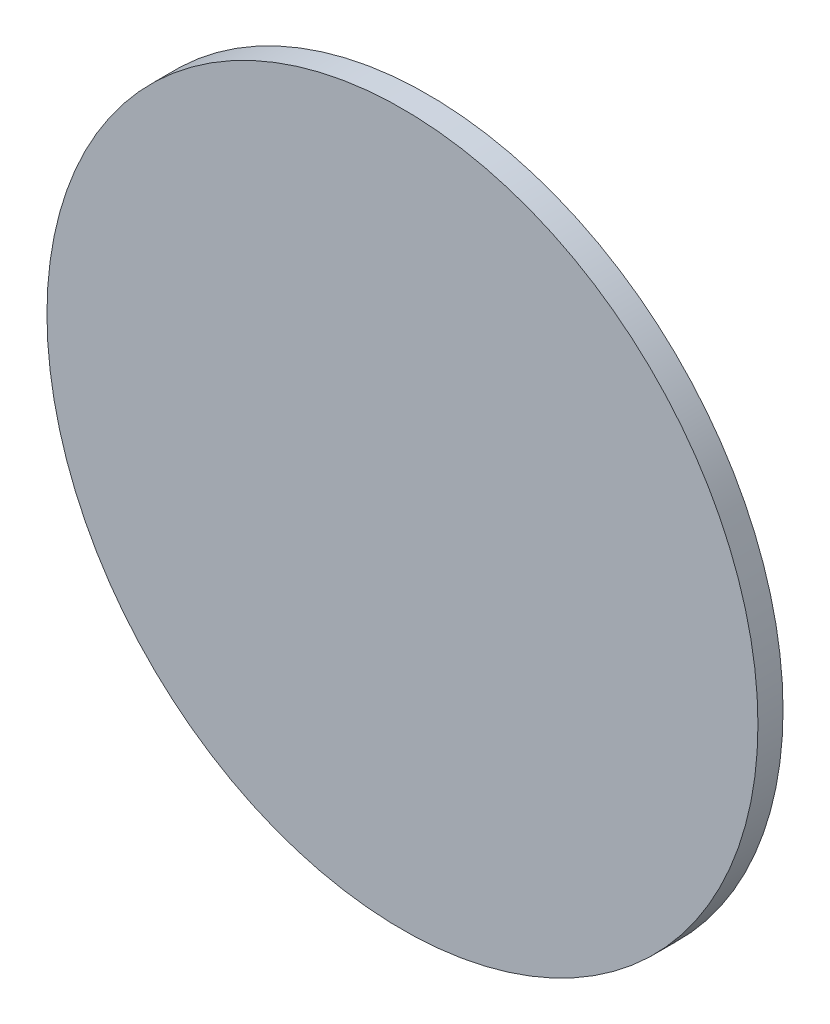
ISO-10303-21;
HEADER;
FILE_DESCRIPTION(('STEP AP214'),'2;1');
FILE_NAME('part.step','',(''),(''),'','','');
FILE_SCHEMA(('AUTOMOTIVE_DESIGN { 1 0 10303 214 1 1 1 1 }'));
ENDSEC;
DATA;
#1=APPLICATION_CONTEXT('core data for automotive mechanical design processes');
#2=APPLICATION_PROTOCOL_DEFINITION('international standard','automotive_design',2000,#1);
#3=PRODUCT_CONTEXT('',#1,'mechanical');
#4=PRODUCT('Part','Part','',(#3));
#5=PRODUCT_RELATED_PRODUCT_CATEGORY('part','',(#4));
#6=PRODUCT_DEFINITION_FORMATION('','',#4);
#7=PRODUCT_DEFINITION_CONTEXT('part definition',#1,'design');
#8=PRODUCT_DEFINITION('design','',#6,#7);
#9=PRODUCT_DEFINITION_SHAPE('','',#8);
#10=(LENGTH_UNIT() NAMED_UNIT(*) SI_UNIT(.MILLI.,.METRE.));
#11=(NAMED_UNIT(*) PLANE_ANGLE_UNIT() SI_UNIT($,.RADIAN.));
#12=(NAMED_UNIT(*) SI_UNIT($,.STERADIAN.) SOLID_ANGLE_UNIT());
#13=UNCERTAINTY_MEASURE_WITH_UNIT(LENGTH_MEASURE(1.E-05),#10,'distance_accuracy_value','');
#14=(GEOMETRIC_REPRESENTATION_CONTEXT(3) GLOBAL_UNCERTAINTY_ASSIGNED_CONTEXT((#13)) GLOBAL_UNIT_ASSIGNED_CONTEXT((#10,
#11,#12)) REPRESENTATION_CONTEXT('',''));
#15=CARTESIAN_POINT('',(0.,0.,0.));
#16=DIRECTION('',(0.,0.,1.));
#17=DIRECTION('',(1.,0.,0.));
#18=AXIS2_PLACEMENT_3D('',#15,#16,#17);
#19=CARTESIAN_POINT('',(0.,0.,3.));
#20=DIRECTION('',(0.,0.,-1.));
#21=DIRECTION('',(-1.,0.,0.));
#22=AXIS2_PLACEMENT_3D('',#19,#20,#21);
#23=CYLINDRICAL_SURFACE('',#22,42.5);
#24=CARTESIAN_POINT('',(0.,0.,3.));
#25=DIRECTION('',(0.,0.,1.));
#26=DIRECTION('',(1.,0.,0.));
#27=AXIS2_PLACEMENT_3D('',#24,#25,#26);
#28=CIRCLE('',#27,42.5);
#29=CARTESIAN_POINT('',(42.5,0.,3.));
#30=VERTEX_POINT('',#29);
#31=EDGE_CURVE('E10',#30,#30,#28,.T.);
#32=ORIENTED_EDGE('',*,*,#31,.F.);
#33=EDGE_LOOP('',(#32));
#34=FACE_BOUND('',#33,.T.);
#35=CARTESIAN_POINT('',(0.,0.,0.));
#36=DIRECTION('',(0.,0.,1.));
#37=DIRECTION('',(1.,0.,0.));
#38=AXIS2_PLACEMENT_3D('',#35,#36,#37);
#39=CIRCLE('',#38,42.5);
#40=CARTESIAN_POINT('',(42.5,0.,0.));
#41=VERTEX_POINT('',#40);
#42=EDGE_CURVE('E35',#41,#41,#39,.T.);
#43=ORIENTED_EDGE('',*,*,#42,.T.);
#44=EDGE_LOOP('',(#43));
#45=FACE_BOUND('',#44,.T.);
#46=ADVANCED_FACE('F32',(#34,#45),#23,.T.);
#47=CARTESIAN_POINT('',(0.,0.,3.));
#48=DIRECTION('',(0.,0.,1.));
#49=DIRECTION('',(1.,0.,0.));
#50=AXIS2_PLACEMENT_3D('',#47,#48,#49);
#51=PLANE('',#50);
#52=ORIENTED_EDGE('',*,*,#31,.T.);
#53=EDGE_LOOP('',(#52));
#54=FACE_BOUND('',#53,.T.);
#55=ADVANCED_FACE('F47',(#54),#51,.T.);
#56=CARTESIAN_POINT('',(0.,0.,0.));
#57=DIRECTION('',(0.,0.,1.));
#58=DIRECTION('',(1.,0.,0.));
#59=AXIS2_PLACEMENT_3D('',#56,#57,#58);
#60=PLANE('',#59);
#61=ORIENTED_EDGE('',*,*,#42,.F.);
#62=EDGE_LOOP('',(#61));
#63=FACE_BOUND('',#62,.T.);
#64=ADVANCED_FACE('F45',(#63),#60,.F.);
#65=CLOSED_SHELL('',(#46,#55,#64));
#66=MANIFOLD_SOLID_BREP('B2',#65);
#67=ADVANCED_BREP_SHAPE_REPRESENTATION('',(#18,#66),#14);
#68=SHAPE_DEFINITION_REPRESENTATION(#9,#67);
ENDSEC;
END-ISO-10303-21;
